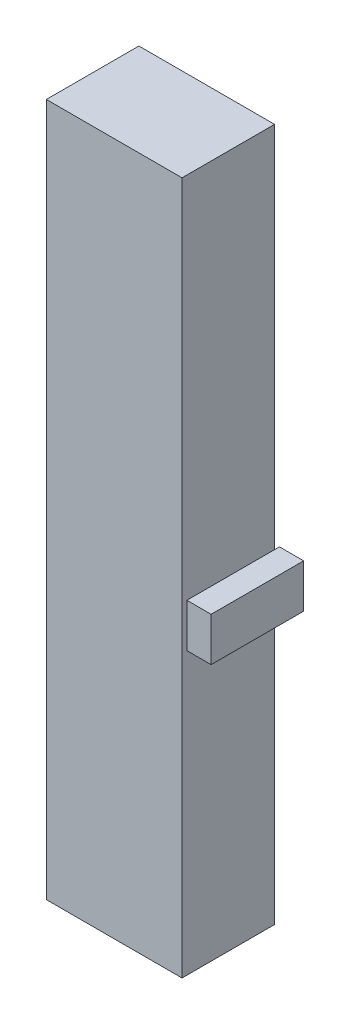
ISO-10303-21;
HEADER;
FILE_DESCRIPTION(('STEP AP214'),'2;1');
FILE_NAME('part.step','',(''),(''),'','','');
FILE_SCHEMA(('AUTOMOTIVE_DESIGN { 1 0 10303 214 1 1 1 1 }'));
ENDSEC;
DATA;
#1=APPLICATION_CONTEXT('core data for automotive mechanical design processes');
#2=APPLICATION_PROTOCOL_DEFINITION('international standard','automotive_design',2000,#1);
#3=PRODUCT_CONTEXT('',#1,'mechanical');
#4=PRODUCT('Part','Part','',(#3));
#5=PRODUCT_RELATED_PRODUCT_CATEGORY('part','',(#4));
#6=PRODUCT_DEFINITION_FORMATION('','',#4);
#7=PRODUCT_DEFINITION_CONTEXT('part definition',#1,'design');
#8=PRODUCT_DEFINITION('design','',#6,#7);
#9=PRODUCT_DEFINITION_SHAPE('','',#8);
#10=(LENGTH_UNIT() NAMED_UNIT(*) SI_UNIT(.MILLI.,.METRE.));
#11=(NAMED_UNIT(*) PLANE_ANGLE_UNIT() SI_UNIT($,.RADIAN.));
#12=(NAMED_UNIT(*) SI_UNIT($,.STERADIAN.) SOLID_ANGLE_UNIT());
#13=UNCERTAINTY_MEASURE_WITH_UNIT(LENGTH_MEASURE(1.E-05),#10,'distance_accuracy_value','');
#14=(GEOMETRIC_REPRESENTATION_CONTEXT(3) GLOBAL_UNCERTAINTY_ASSIGNED_CONTEXT((#13)) GLOBAL_UNIT_ASSIGNED_CONTEXT((#10,
#11,#12)) REPRESENTATION_CONTEXT('',''));
#15=CARTESIAN_POINT('',(0.,0.,0.));
#16=DIRECTION('',(0.,0.,1.));
#17=DIRECTION('',(1.,0.,0.));
#18=AXIS2_PLACEMENT_3D('',#15,#16,#17);
#19=CARTESIAN_POINT('',(1.3,4.8,0.25));
#20=DIRECTION('',(-1.,0.,0.));
#21=DIRECTION('',(0.,0.,1.));
#22=AXIS2_PLACEMENT_3D('',#19,#20,#21);
#23=PLANE('',#22);
#24=DIRECTION('',(0.,0.,-1.));
#25=VECTOR('',#24,1.);
#26=CARTESIAN_POINT('',(1.3,5.7,0.25));
#27=LINE('',#26,#25);
#28=CARTESIAN_POINT('',(1.3,5.7,0.25));
#29=VERTEX_POINT('',#28);
#30=CARTESIAN_POINT('',(1.3,5.7,2.16));
#31=VERTEX_POINT('',#30);
#32=EDGE_CURVE('P0_E65',#29,#31,#27,.F.);
#33=ORIENTED_EDGE('',*,*,#32,.T.);
#34=DIRECTION('',(0.,1.,0.));
#35=VECTOR('',#34,1.);
#36=CARTESIAN_POINT('',(1.3,5.7,2.16));
#37=LINE('',#36,#35);
#38=CARTESIAN_POINT('',(1.3,4.8,2.16));
#39=VERTEX_POINT('',#38);
#40=EDGE_CURVE('P0_E55',#31,#39,#37,.F.);
#41=ORIENTED_EDGE('',*,*,#40,.T.);
#42=DIRECTION('',(0.,0.,1.));
#43=VECTOR('',#42,1.);
#44=CARTESIAN_POINT('',(1.3,4.8,0.25));
#45=LINE('',#44,#43);
#46=CARTESIAN_POINT('',(1.3,4.8,0.25));
#47=VERTEX_POINT('',#46);
#48=EDGE_CURVE('P0_E75',#39,#47,#45,.F.);
#49=ORIENTED_EDGE('',*,*,#48,.T.);
#50=DIRECTION('',(0.,1.,0.));
#51=VECTOR('',#50,1.);
#52=CARTESIAN_POINT('',(1.3,4.8,0.25));
#53=LINE('',#52,#51);
#54=EDGE_CURVE('P0_E20',#29,#47,#53,.F.);
#55=ORIENTED_EDGE('',*,*,#54,.F.);
#56=EDGE_LOOP('',(#33,#41,#49,#55));
#57=FACE_BOUND('',#56,.T.);
#58=ADVANCED_FACE('P0_F17',(#57),#23,.F.);
#59=CARTESIAN_POINT('',(1.3,5.7,0.25));
#60=DIRECTION('',(0.,-1.,0.));
#61=DIRECTION('',(0.,0.,-1.));
#62=AXIS2_PLACEMENT_3D('',#59,#60,#61);
#63=PLANE('',#62);
#64=DIRECTION('',(0.,0.,-1.));
#65=VECTOR('',#64,1.);
#66=CARTESIAN_POINT('',(0.8,5.7,0.25));
#67=LINE('',#66,#65);
#68=CARTESIAN_POINT('',(0.8,5.7,0.25));
#69=VERTEX_POINT('',#68);
#70=CARTESIAN_POINT('',(0.8,5.7,2.16));
#71=VERTEX_POINT('',#70);
#72=EDGE_CURVE('P0_E73',#69,#71,#67,.F.);
#73=ORIENTED_EDGE('',*,*,#72,.T.);
#74=DIRECTION('',(-1.,0.,0.));
#75=VECTOR('',#74,1.);
#76=CARTESIAN_POINT('',(1.3,5.7,2.16));
#77=LINE('',#76,#75);
#78=EDGE_CURVE('P0_E62',#71,#31,#77,.F.);
#79=ORIENTED_EDGE('',*,*,#78,.T.);
#80=ORIENTED_EDGE('',*,*,#32,.F.);
#81=DIRECTION('',(-1.,0.,0.));
#82=VECTOR('',#81,1.);
#83=CARTESIAN_POINT('',(1.3,5.7,0.25));
#84=LINE('',#83,#82);
#85=EDGE_CURVE('P0_E80',#69,#29,#84,.F.);
#86=ORIENTED_EDGE('',*,*,#85,.F.);
#87=EDGE_LOOP('',(#73,#79,#80,#86));
#88=FACE_BOUND('',#87,.T.);
#89=ADVANCED_FACE('P0_F72',(#88),#63,.F.);
#90=CARTESIAN_POINT('',(1.3,5.7,2.16));
#91=DIRECTION('',(0.,0.,-1.));
#92=DIRECTION('',(-1.,0.,0.));
#93=AXIS2_PLACEMENT_3D('',#90,#91,#92);
#94=PLANE('',#93);
#95=DIRECTION('',(0.,1.,0.));
#96=VECTOR('',#95,1.);
#97=CARTESIAN_POINT('',(0.8,5.7,2.16));
#98=LINE('',#97,#96);
#99=CARTESIAN_POINT('',(0.8,4.8,2.16));
#100=VERTEX_POINT('',#99);
#101=EDGE_CURVE('P0_E83',#71,#100,#98,.F.);
#102=ORIENTED_EDGE('',*,*,#101,.T.);
#103=DIRECTION('',(1.,0.,0.));
#104=VECTOR('',#103,1.);
#105=CARTESIAN_POINT('',(0.8,4.8,2.16));
#106=LINE('',#105,#104);
#107=EDGE_CURVE('P0_E64',#100,#39,#106,.T.);
#108=ORIENTED_EDGE('',*,*,#107,.T.);
#109=ORIENTED_EDGE('',*,*,#40,.F.);
#110=ORIENTED_EDGE('',*,*,#78,.F.);
#111=EDGE_LOOP('',(#102,#108,#109,#110));
#112=FACE_BOUND('',#111,.T.);
#113=ADVANCED_FACE('P0_F60',(#112),#94,.F.);
#114=CARTESIAN_POINT('',(0.8,4.8,0.25));
#115=DIRECTION('',(0.,1.,0.));
#116=DIRECTION('',(0.,0.,1.));
#117=AXIS2_PLACEMENT_3D('',#114,#115,#116);
#118=PLANE('',#117);
#119=ORIENTED_EDGE('',*,*,#48,.F.);
#120=ORIENTED_EDGE('',*,*,#107,.F.);
#121=DIRECTION('',(0.,0.,-1.));
#122=VECTOR('',#121,1.);
#123=CARTESIAN_POINT('',(0.8,4.8,0.25));
#124=LINE('',#123,#122);
#125=CARTESIAN_POINT('',(0.8,4.8,0.25));
#126=VERTEX_POINT('',#125);
#127=EDGE_CURVE('P0_E26',#100,#126,#124,.T.);
#128=ORIENTED_EDGE('',*,*,#127,.T.);
#129=DIRECTION('',(-1.,0.,0.));
#130=VECTOR('',#129,1.);
#131=CARTESIAN_POINT('',(1.3,4.8,0.25));
#132=LINE('',#131,#130);
#133=EDGE_CURVE('P0_E34',#47,#126,#132,.T.);
#134=ORIENTED_EDGE('',*,*,#133,.F.);
#135=EDGE_LOOP('',(#119,#120,#128,#134));
#136=FACE_BOUND('',#135,.T.);
#137=ADVANCED_FACE('P0_F88',(#136),#118,.F.);
#138=CARTESIAN_POINT('',(1.3,5.7,0.25));
#139=DIRECTION('',(0.,0.,-1.));
#140=DIRECTION('',(-1.,0.,0.));
#141=AXIS2_PLACEMENT_3D('',#138,#139,#140);
#142=PLANE('',#141);
#143=DIRECTION('',(0.,1.,0.));
#144=VECTOR('',#143,1.);
#145=CARTESIAN_POINT('',(0.8,5.7,0.25));
#146=LINE('',#145,#144);
#147=EDGE_CURVE('P0_E11',#126,#69,#146,.T.);
#148=ORIENTED_EDGE('',*,*,#147,.T.);
#149=ORIENTED_EDGE('',*,*,#85,.T.);
#150=ORIENTED_EDGE('',*,*,#54,.T.);
#151=ORIENTED_EDGE('',*,*,#133,.T.);
#152=EDGE_LOOP('',(#148,#149,#150,#151));
#153=FACE_BOUND('',#152,.T.);
#154=ADVANCED_FACE('P0_F91',(#153),#142,.T.);
#155=CARTESIAN_POINT('',(0.8,5.7,0.25));
#156=DIRECTION('',(1.,0.,0.));
#157=DIRECTION('',(0.,0.,-1.));
#158=AXIS2_PLACEMENT_3D('',#155,#156,#157);
#159=PLANE('',#158);
#160=ORIENTED_EDGE('',*,*,#127,.F.);
#161=ORIENTED_EDGE('',*,*,#101,.F.);
#162=ORIENTED_EDGE('',*,*,#72,.F.);
#163=ORIENTED_EDGE('',*,*,#147,.F.);
#164=EDGE_LOOP('',(#160,#161,#162,#163));
#165=FACE_BOUND('',#164,.T.);
#166=ADVANCED_FACE('P0_F90',(#165),#159,.F.);
#167=CLOSED_SHELL('',(#58,#89,#113,#137,#154,#166));
#168=MANIFOLD_SOLID_BREP('P0_B1',#167);
#169=CARTESIAN_POINT('',(0.7,13.2,2.16));
#170=DIRECTION('',(0.,0.,-1.));
#171=DIRECTION('',(-1.,0.,0.));
#172=AXIS2_PLACEMENT_3D('',#169,#170,#171);
#173=PLANE('',#172);
#174=DIRECTION('',(0.,1.,0.));
#175=VECTOR('',#174,1.);
#176=CARTESIAN_POINT('',(-2.1,13.2,2.16));
#177=LINE('',#176,#175);
#178=CARTESIAN_POINT('',(-2.1,13.2,2.16));
#179=VERTEX_POINT('',#178);
#180=CARTESIAN_POINT('',(-2.1,-1.1,2.16));
#181=VERTEX_POINT('',#180);
#182=EDGE_CURVE('P1_E55',#179,#181,#177,.F.);
#183=ORIENTED_EDGE('',*,*,#182,.T.);
#184=DIRECTION('',(1.,0.,0.));
#185=VECTOR('',#184,1.);
#186=CARTESIAN_POINT('',(-2.1,-1.1,2.16));
#187=LINE('',#186,#185);
#188=CARTESIAN_POINT('',(0.7,-1.1,2.16));
#189=VERTEX_POINT('',#188);
#190=EDGE_CURVE('P1_E57',#181,#189,#187,.T.);
#191=ORIENTED_EDGE('',*,*,#190,.T.);
#192=DIRECTION('',(0.,1.,0.));
#193=VECTOR('',#192,1.);
#194=CARTESIAN_POINT('',(0.7,-1.1,2.16));
#195=LINE('',#194,#193);
#196=CARTESIAN_POINT('',(0.7,13.2,2.16));
#197=VERTEX_POINT('',#196);
#198=EDGE_CURVE('P1_E20',#189,#197,#195,.T.);
#199=ORIENTED_EDGE('',*,*,#198,.T.);
#200=DIRECTION('',(1.,0.,0.));
#201=VECTOR('',#200,1.);
#202=CARTESIAN_POINT('',(0.7,13.2,2.16));
#203=LINE('',#202,#201);
#204=EDGE_CURVE('P1_E80',#197,#179,#203,.F.);
#205=ORIENTED_EDGE('',*,*,#204,.T.);
#206=EDGE_LOOP('',(#183,#191,#199,#205));
#207=FACE_BOUND('',#206,.T.);
#208=ADVANCED_FACE('P1_F17',(#207),#173,.F.);
#209=CARTESIAN_POINT('',(0.7,-1.1,0.25));
#210=DIRECTION('',(-1.,0.,0.));
#211=DIRECTION('',(0.,0.,1.));
#212=AXIS2_PLACEMENT_3D('',#209,#210,#211);
#213=PLANE('',#212);
#214=DIRECTION('',(0.,0.,-1.));
#215=VECTOR('',#214,1.);
#216=CARTESIAN_POINT('',(0.7,13.2,0.25));
#217=LINE('',#216,#215);
#218=CARTESIAN_POINT('',(0.7,13.2,0.25));
#219=VERTEX_POINT('',#218);
#220=EDGE_CURVE('P1_E68',#219,#197,#217,.F.);
#221=ORIENTED_EDGE('',*,*,#220,.T.);
#222=ORIENTED_EDGE('',*,*,#198,.F.);
#223=DIRECTION('',(0.,0.,1.));
#224=VECTOR('',#223,1.);
#225=CARTESIAN_POINT('',(0.7,-1.1,0.25));
#226=LINE('',#225,#224);
#227=CARTESIAN_POINT('',(0.7,-1.1,0.25));
#228=VERTEX_POINT('',#227);
#229=EDGE_CURVE('P1_E63',#189,#228,#226,.F.);
#230=ORIENTED_EDGE('',*,*,#229,.T.);
#231=DIRECTION('',(0.,1.,0.));
#232=VECTOR('',#231,1.);
#233=CARTESIAN_POINT('',(0.7,13.2,0.25));
#234=LINE('',#233,#232);
#235=EDGE_CURVE('P1_E83',#219,#228,#234,.F.);
#236=ORIENTED_EDGE('',*,*,#235,.F.);
#237=EDGE_LOOP('',(#221,#222,#230,#236));
#238=FACE_BOUND('',#237,.T.);
#239=ADVANCED_FACE('P1_F65',(#238),#213,.F.);
#240=CARTESIAN_POINT('',(-2.1,-1.1,0.25));
#241=DIRECTION('',(0.,1.,0.));
#242=DIRECTION('',(0.,0.,1.));
#243=AXIS2_PLACEMENT_3D('',#240,#241,#242);
#244=PLANE('',#243);
#245=ORIENTED_EDGE('',*,*,#229,.F.);
#246=ORIENTED_EDGE('',*,*,#190,.F.);
#247=DIRECTION('',(0.,0.,-1.));
#248=VECTOR('',#247,1.);
#249=CARTESIAN_POINT('',(-2.1,-1.1,0.25));
#250=LINE('',#249,#248);
#251=CARTESIAN_POINT('',(-2.1,-1.1,0.25));
#252=VERTEX_POINT('',#251);
#253=EDGE_CURVE('P1_E75',#181,#252,#250,.T.);
#254=ORIENTED_EDGE('',*,*,#253,.T.);
#255=DIRECTION('',(-1.,0.,0.));
#256=VECTOR('',#255,1.);
#257=CARTESIAN_POINT('',(0.7,-1.1,0.25));
#258=LINE('',#257,#256);
#259=EDGE_CURVE('P1_E72',#228,#252,#258,.T.);
#260=ORIENTED_EDGE('',*,*,#259,.F.);
#261=EDGE_LOOP('',(#245,#246,#254,#260));
#262=FACE_BOUND('',#261,.T.);
#263=ADVANCED_FACE('P1_F70',(#262),#244,.F.);
#264=CARTESIAN_POINT('',(-2.1,13.2,0.25));
#265=DIRECTION('',(1.,0.,0.));
#266=DIRECTION('',(0.,0.,-1.));
#267=AXIS2_PLACEMENT_3D('',#264,#265,#266);
#268=PLANE('',#267);
#269=ORIENTED_EDGE('',*,*,#253,.F.);
#270=ORIENTED_EDGE('',*,*,#182,.F.);
#271=DIRECTION('',(0.,0.,-1.));
#272=VECTOR('',#271,1.);
#273=CARTESIAN_POINT('',(-2.1,13.2,0.25));
#274=LINE('',#273,#272);
#275=CARTESIAN_POINT('',(-2.1,13.2,0.25));
#276=VERTEX_POINT('',#275);
#277=EDGE_CURVE('P1_E35',#179,#276,#274,.T.);
#278=ORIENTED_EDGE('',*,*,#277,.T.);
#279=DIRECTION('',(0.,1.,0.));
#280=VECTOR('',#279,1.);
#281=CARTESIAN_POINT('',(-2.1,13.2,0.25));
#282=LINE('',#281,#280);
#283=EDGE_CURVE('P1_E26',#252,#276,#282,.T.);
#284=ORIENTED_EDGE('',*,*,#283,.F.);
#285=EDGE_LOOP('',(#269,#270,#278,#284));
#286=FACE_BOUND('',#285,.T.);
#287=ADVANCED_FACE('P1_F89',(#286),#268,.F.);
#288=CARTESIAN_POINT('',(0.7,13.2,0.25));
#289=DIRECTION('',(0.,-1.,0.));
#290=DIRECTION('',(0.,0.,-1.));
#291=AXIS2_PLACEMENT_3D('',#288,#289,#290);
#292=PLANE('',#291);
#293=ORIENTED_EDGE('',*,*,#277,.F.);
#294=ORIENTED_EDGE('',*,*,#204,.F.);
#295=ORIENTED_EDGE('',*,*,#220,.F.);
#296=DIRECTION('',(-1.,0.,0.));
#297=VECTOR('',#296,1.);
#298=CARTESIAN_POINT('',(0.7,13.2,0.25));
#299=LINE('',#298,#297);
#300=EDGE_CURVE('P1_E11',#276,#219,#299,.F.);
#301=ORIENTED_EDGE('',*,*,#300,.F.);
#302=EDGE_LOOP('',(#293,#294,#295,#301));
#303=FACE_BOUND('',#302,.T.);
#304=ADVANCED_FACE('P1_F91',(#303),#292,.F.);
#305=CARTESIAN_POINT('',(0.7,13.2,0.25));
#306=DIRECTION('',(0.,0.,-1.));
#307=DIRECTION('',(-1.,0.,0.));
#308=AXIS2_PLACEMENT_3D('',#305,#306,#307);
#309=PLANE('',#308);
#310=ORIENTED_EDGE('',*,*,#283,.T.);
#311=ORIENTED_EDGE('',*,*,#300,.T.);
#312=ORIENTED_EDGE('',*,*,#235,.T.);
#313=ORIENTED_EDGE('',*,*,#259,.T.);
#314=EDGE_LOOP('',(#310,#311,#312,#313));
#315=FACE_BOUND('',#314,.T.);
#316=ADVANCED_FACE('P1_F88',(#315),#309,.T.);
#317=CLOSED_SHELL('',(#208,#239,#263,#287,#304,#316));
#318=MANIFOLD_SOLID_BREP('P1_B1',#317);
#319=ADVANCED_BREP_SHAPE_REPRESENTATION('',(#18,#168,#318),#14);
#320=SHAPE_DEFINITION_REPRESENTATION(#9,#319);
ENDSEC;
END-ISO-10303-21;
